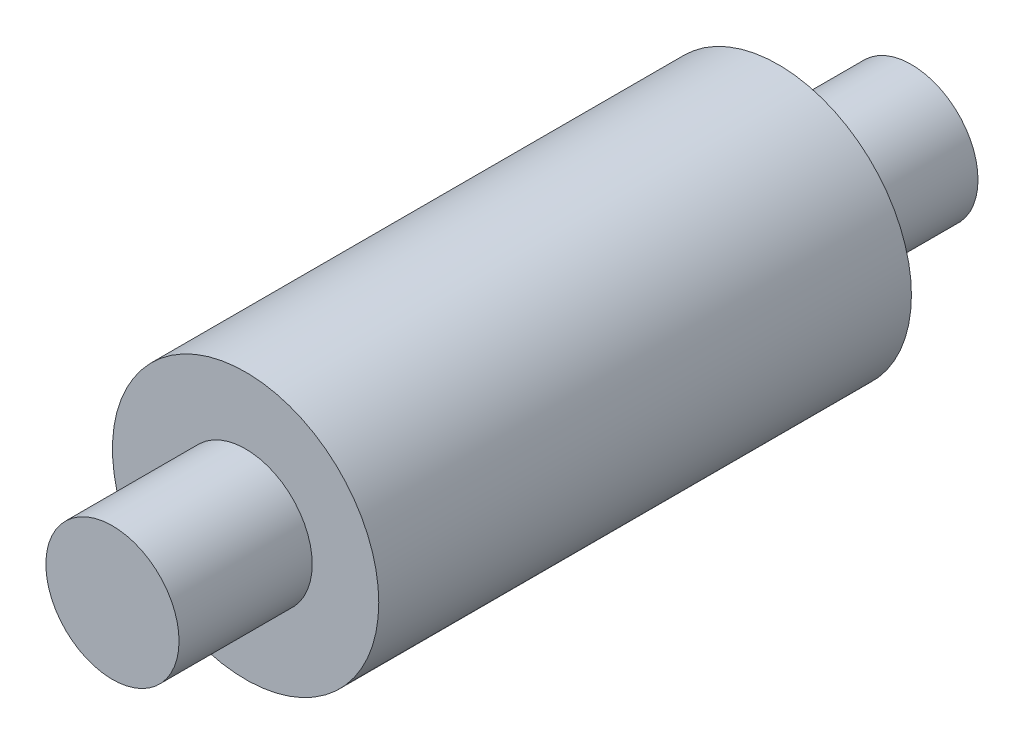
ISO-10303-21;
HEADER;
FILE_DESCRIPTION(('STEP AP214'),'2;1');
FILE_NAME('part.step','',(''),(''),'','','');
FILE_SCHEMA(('AUTOMOTIVE_DESIGN { 1 0 10303 214 1 1 1 1 }'));
ENDSEC;
DATA;
#1=APPLICATION_CONTEXT('core data for automotive mechanical design processes');
#2=APPLICATION_PROTOCOL_DEFINITION('international standard','automotive_design',2000,#1);
#3=PRODUCT_CONTEXT('',#1,'mechanical');
#4=PRODUCT('Part','Part','',(#3));
#5=PRODUCT_RELATED_PRODUCT_CATEGORY('part','',(#4));
#6=PRODUCT_DEFINITION_FORMATION('','',#4);
#7=PRODUCT_DEFINITION_CONTEXT('part definition',#1,'design');
#8=PRODUCT_DEFINITION('design','',#6,#7);
#9=PRODUCT_DEFINITION_SHAPE('','',#8);
#10=(LENGTH_UNIT() NAMED_UNIT(*) SI_UNIT(.MILLI.,.METRE.));
#11=(NAMED_UNIT(*) PLANE_ANGLE_UNIT() SI_UNIT($,.RADIAN.));
#12=(NAMED_UNIT(*) SI_UNIT($,.STERADIAN.) SOLID_ANGLE_UNIT());
#13=UNCERTAINTY_MEASURE_WITH_UNIT(LENGTH_MEASURE(1.E-05),#10,'distance_accuracy_value','');
#14=(GEOMETRIC_REPRESENTATION_CONTEXT(3) GLOBAL_UNCERTAINTY_ASSIGNED_CONTEXT((#13)) GLOBAL_UNIT_ASSIGNED_CONTEXT((#10,
#11,#12)) REPRESENTATION_CONTEXT('',''));
#15=CARTESIAN_POINT('',(0.,0.,0.));
#16=DIRECTION('',(0.,0.,1.));
#17=DIRECTION('',(1.,0.,0.));
#18=AXIS2_PLACEMENT_3D('',#15,#16,#17);
#19=CARTESIAN_POINT('',(0.,0.,10.));
#20=DIRECTION('',(0.,0.,-1.));
#21=DIRECTION('',(-1.,0.,0.));
#22=AXIS2_PLACEMENT_3D('',#19,#20,#21);
#23=CYLINDRICAL_SURFACE('',#22,5.);
#24=CARTESIAN_POINT('',(0.,0.,10.));
#25=DIRECTION('',(0.,0.,1.));
#26=DIRECTION('',(1.,0.,0.));
#27=AXIS2_PLACEMENT_3D('',#24,#25,#26);
#28=CIRCLE('',#27,5.);
#29=CARTESIAN_POINT('',(5.,0.,10.));
#30=VERTEX_POINT('',#29);
#31=EDGE_CURVE('E45',#30,#30,#28,.T.);
#32=ORIENTED_EDGE('',*,*,#31,.F.);
#33=EDGE_LOOP('',(#32));
#34=FACE_BOUND('',#33,.T.);
#35=CARTESIAN_POINT('',(0.,0.,-10.));
#36=DIRECTION('',(0.,0.,1.));
#37=DIRECTION('',(1.,0.,0.));
#38=AXIS2_PLACEMENT_3D('',#35,#36,#37);
#39=CIRCLE('',#38,5.);
#40=CARTESIAN_POINT('',(5.,0.,-10.));
#41=VERTEX_POINT('',#40);
#42=EDGE_CURVE('E40',#41,#41,#39,.T.);
#43=ORIENTED_EDGE('',*,*,#42,.T.);
#44=EDGE_LOOP('',(#43));
#45=FACE_BOUND('',#44,.T.);
#46=ADVANCED_FACE('F37',(#34,#45),#23,.T.);
#47=CARTESIAN_POINT('',(0.,0.,10.));
#48=DIRECTION('',(0.,0.,1.));
#49=DIRECTION('',(1.,0.,0.));
#50=AXIS2_PLACEMENT_3D('',#47,#48,#49);
#51=PLANE('',#50);
#52=CARTESIAN_POINT('',(0.,0.,10.));
#53=DIRECTION('',(0.,0.,1.));
#54=DIRECTION('',(1.,0.,0.));
#55=AXIS2_PLACEMENT_3D('',#52,#53,#54);
#56=CIRCLE('',#55,2.5);
#57=CARTESIAN_POINT('',(2.5,0.,10.));
#58=VERTEX_POINT('',#57);
#59=EDGE_CURVE('E10',#58,#58,#56,.T.);
#60=ORIENTED_EDGE('',*,*,#59,.F.);
#61=EDGE_LOOP('',(#60));
#62=FACE_BOUND('',#61,.T.);
#63=ORIENTED_EDGE('',*,*,#31,.T.);
#64=EDGE_LOOP('',(#63));
#65=FACE_BOUND('',#64,.T.);
#66=ADVANCED_FACE('F77',(#62,#65),#51,.T.);
#67=CARTESIAN_POINT('',(0.,0.,-10.));
#68=DIRECTION('',(0.,0.,1.));
#69=DIRECTION('',(1.,0.,0.));
#70=AXIS2_PLACEMENT_3D('',#67,#68,#69);
#71=PLANE('',#70);
#72=CARTESIAN_POINT('',(0.,0.,-10.));
#73=DIRECTION('',(0.,0.,1.));
#74=DIRECTION('',(1.,0.,0.));
#75=AXIS2_PLACEMENT_3D('',#72,#73,#74);
#76=CIRCLE('',#75,2.5);
#77=CARTESIAN_POINT('',(2.5,0.,-10.));
#78=VERTEX_POINT('',#77);
#79=EDGE_CURVE('E57',#78,#78,#76,.T.);
#80=ORIENTED_EDGE('',*,*,#79,.T.);
#81=EDGE_LOOP('',(#80));
#82=FACE_BOUND('',#81,.T.);
#83=ORIENTED_EDGE('',*,*,#42,.F.);
#84=EDGE_LOOP('',(#83));
#85=FACE_BOUND('',#84,.T.);
#86=ADVANCED_FACE('F82',(#82,#85),#71,.F.);
#87=CARTESIAN_POINT('',(0.,0.,15.));
#88=DIRECTION('',(0.,0.,-1.));
#89=DIRECTION('',(-1.,0.,0.));
#90=AXIS2_PLACEMENT_3D('',#87,#88,#89);
#91=CYLINDRICAL_SURFACE('',#90,2.5);
#92=CARTESIAN_POINT('',(0.,0.,15.));
#93=DIRECTION('',(0.,0.,1.));
#94=DIRECTION('',(1.,0.,0.));
#95=AXIS2_PLACEMENT_3D('',#92,#93,#94);
#96=CIRCLE('',#95,2.5);
#97=CARTESIAN_POINT('',(2.5,0.,15.));
#98=VERTEX_POINT('',#97);
#99=EDGE_CURVE('E52',#98,#98,#96,.T.);
#100=ORIENTED_EDGE('',*,*,#99,.F.);
#101=EDGE_LOOP('',(#100));
#102=FACE_BOUND('',#101,.T.);
#103=ORIENTED_EDGE('',*,*,#59,.T.);
#104=EDGE_LOOP('',(#103));
#105=FACE_BOUND('',#104,.T.);
#106=ADVANCED_FACE('F92',(#102,#105),#91,.T.);
#107=CARTESIAN_POINT('',(0.,0.,15.));
#108=DIRECTION('',(0.,0.,1.));
#109=DIRECTION('',(1.,0.,0.));
#110=AXIS2_PLACEMENT_3D('',#107,#108,#109);
#111=PLANE('',#110);
#112=ORIENTED_EDGE('',*,*,#99,.T.);
#113=EDGE_LOOP('',(#112));
#114=FACE_BOUND('',#113,.T.);
#115=ADVANCED_FACE('F74',(#114),#111,.T.);
#116=CARTESIAN_POINT('',(0.,0.,-15.));
#117=DIRECTION('',(0.,0.,1.));
#118=DIRECTION('',(1.,0.,0.));
#119=AXIS2_PLACEMENT_3D('',#116,#117,#118);
#120=CYLINDRICAL_SURFACE('',#119,2.5);
#121=CARTESIAN_POINT('',(0.,0.,-15.));
#122=DIRECTION('',(0.,0.,1.));
#123=DIRECTION('',(1.,0.,0.));
#124=AXIS2_PLACEMENT_3D('',#121,#122,#123);
#125=CIRCLE('',#124,2.5);
#126=CARTESIAN_POINT('',(2.5,0.,-15.));
#127=VERTEX_POINT('',#126);
#128=EDGE_CURVE('E56',#127,#127,#125,.T.);
#129=ORIENTED_EDGE('',*,*,#128,.T.);
#130=EDGE_LOOP('',(#129));
#131=FACE_BOUND('',#130,.T.);
#132=ORIENTED_EDGE('',*,*,#79,.F.);
#133=EDGE_LOOP('',(#132));
#134=FACE_BOUND('',#133,.T.);
#135=ADVANCED_FACE('F65',(#131,#134),#120,.T.);
#136=CARTESIAN_POINT('',(0.,0.,-15.));
#137=DIRECTION('',(0.,0.,-1.));
#138=DIRECTION('',(1.,0.,0.));
#139=AXIS2_PLACEMENT_3D('',#136,#137,#138);
#140=PLANE('',#139);
#141=ORIENTED_EDGE('',*,*,#128,.F.);
#142=EDGE_LOOP('',(#141));
#143=FACE_BOUND('',#142,.T.);
#144=ADVANCED_FACE('F68',(#143),#140,.T.);
#145=CLOSED_SHELL('',(#46,#66,#86,#106,#115,#135,#144));
#146=MANIFOLD_SOLID_BREP('B2',#145);
#147=ADVANCED_BREP_SHAPE_REPRESENTATION('',(#18,#146),#14);
#148=SHAPE_DEFINITION_REPRESENTATION(#9,#147);
ENDSEC;
END-ISO-10303-21;
